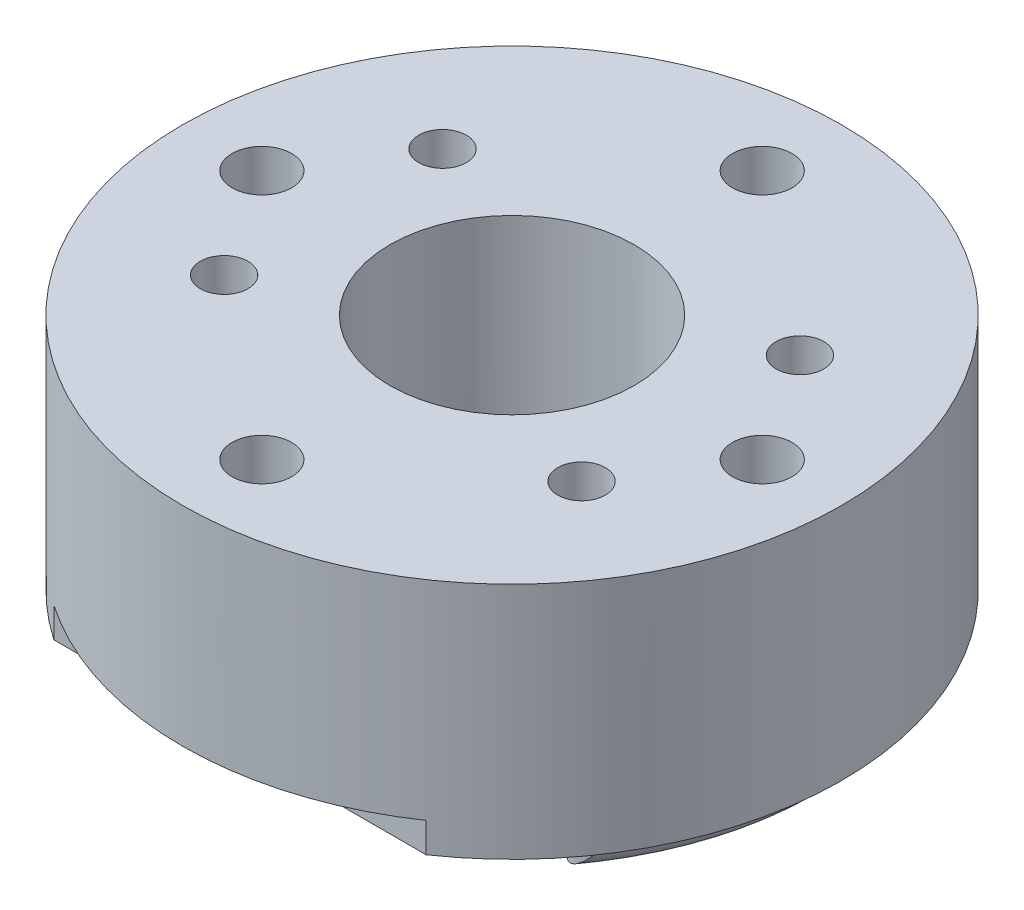
ISO-10303-21;
HEADER;
FILE_DESCRIPTION(('STEP AP214'),'2;1');
FILE_NAME('part.step','',(''),(''),'','','');
FILE_SCHEMA(('AUTOMOTIVE_DESIGN { 1 0 10303 214 1 1 1 1 }'));
ENDSEC;
DATA;
#1=APPLICATION_CONTEXT('core data for automotive mechanical design processes');
#2=APPLICATION_PROTOCOL_DEFINITION('international standard','automotive_design',2000,#1);
#3=PRODUCT_CONTEXT('',#1,'mechanical');
#4=PRODUCT('Part','Part','',(#3));
#5=PRODUCT_RELATED_PRODUCT_CATEGORY('part','',(#4));
#6=PRODUCT_DEFINITION_FORMATION('','',#4);
#7=PRODUCT_DEFINITION_CONTEXT('part definition',#1,'design');
#8=PRODUCT_DEFINITION('design','',#6,#7);
#9=PRODUCT_DEFINITION_SHAPE('','',#8);
#10=(LENGTH_UNIT() NAMED_UNIT(*) SI_UNIT(.MILLI.,.METRE.));
#11=(NAMED_UNIT(*) PLANE_ANGLE_UNIT() SI_UNIT($,.RADIAN.));
#12=(NAMED_UNIT(*) SI_UNIT($,.STERADIAN.) SOLID_ANGLE_UNIT());
#13=UNCERTAINTY_MEASURE_WITH_UNIT(LENGTH_MEASURE(1.E-05),#10,'distance_accuracy_value','');
#14=(GEOMETRIC_REPRESENTATION_CONTEXT(3) GLOBAL_UNCERTAINTY_ASSIGNED_CONTEXT((#13)) GLOBAL_UNIT_ASSIGNED_CONTEXT((#10,
#11,#12)) REPRESENTATION_CONTEXT('',''));
#15=CARTESIAN_POINT('',(0.,0.,0.));
#16=DIRECTION('',(0.,0.,1.));
#17=DIRECTION('',(1.,0.,0.));
#18=AXIS2_PLACEMENT_3D('',#15,#16,#17);
#19=CARTESIAN_POINT('',(-11.2,-13.5,-7.69999999999999));
#20=DIRECTION('',(-1.,0.,0.));
#21=DIRECTION('',(0.,-1.,0.));
#22=AXIS2_PLACEMENT_3D('',#19,#20,#21);
#23=PLANE('',#22);
#24=DIRECTION('',(0.,0.,1.));
#25=VECTOR('',#24,1.);
#26=CARTESIAN_POINT('',(-11.2,-12.,-7.69999999999999));
#27=LINE('',#26,#25);
#28=CARTESIAN_POINT('',(-11.2,-12.,0.538516480713569));
#29=VERTEX_POINT('',#28);
#30=CARTESIAN_POINT('',(-11.2,-12.,8.01997506230538));
#31=VERTEX_POINT('',#30);
#32=EDGE_CURVE('E326',#29,#31,#27,.T.);
#33=ORIENTED_EDGE('',*,*,#32,.T.);
#34=DIRECTION('',(0.,1.,0.));
#35=VECTOR('',#34,1.);
#36=CARTESIAN_POINT('',(-11.2,-13.5,8.01997506230538));
#37=LINE('',#36,#35);
#38=CARTESIAN_POINT('',(-11.2,-13.5,8.01997506230538));
#39=VERTEX_POINT('',#38);
#40=EDGE_CURVE('E362',#31,#39,#37,.F.);
#41=ORIENTED_EDGE('',*,*,#40,.T.);
#42=DIRECTION('',(0.,0.,1.));
#43=VECTOR('',#42,1.);
#44=CARTESIAN_POINT('',(-11.2,-13.5,-7.69999999999999));
#45=LINE('',#44,#43);
#46=CARTESIAN_POINT('',(-11.2,-13.5,0.538516480713569));
#47=VERTEX_POINT('',#46);
#48=EDGE_CURVE('E315',#47,#39,#45,.T.);
#49=ORIENTED_EDGE('',*,*,#48,.F.);
#50=DIRECTION('',(0.,1.,0.));
#51=VECTOR('',#50,1.);
#52=CARTESIAN_POINT('',(-11.2,-13.5,0.538516480713569));
#53=LINE('',#52,#51);
#54=EDGE_CURVE('E271',#47,#29,#53,.T.);
#55=ORIENTED_EDGE('',*,*,#54,.T.);
#56=EDGE_LOOP('',(#33,#41,#49,#55));
#57=FACE_BOUND('',#56,.T.);
#58=ADVANCED_FACE('F33',(#57),#23,.F.);
#59=CARTESIAN_POINT('',(11.2,-13.5,10.8590975683986));
#60=DIRECTION('',(1.,0.,0.));
#61=DIRECTION('',(0.,1.,0.));
#62=AXIS2_PLACEMENT_3D('',#59,#60,#61);
#63=PLANE('',#62);
#64=DIRECTION('',(0.,0.,-1.));
#65=VECTOR('',#64,1.);
#66=CARTESIAN_POINT('',(11.2,-13.5,10.8590975683986));
#67=LINE('',#66,#65);
#68=CARTESIAN_POINT('',(11.2,-13.5,-0.538516480713569));
#69=VERTEX_POINT('',#68);
#70=CARTESIAN_POINT('',(11.2,-13.5,-7.69999999999999));
#71=VERTEX_POINT('',#70);
#72=EDGE_CURVE('E320',#69,#71,#67,.T.);
#73=ORIENTED_EDGE('',*,*,#72,.F.);
#74=DIRECTION('',(0.,1.,0.));
#75=VECTOR('',#74,1.);
#76=CARTESIAN_POINT('',(11.2,-13.5,-0.538516480713569));
#77=LINE('',#76,#75);
#78=CARTESIAN_POINT('',(11.2,-12.,-0.538516480713569));
#79=VERTEX_POINT('',#78);
#80=EDGE_CURVE('E280',#69,#79,#77,.T.);
#81=ORIENTED_EDGE('',*,*,#80,.T.);
#82=DIRECTION('',(0.,0.,-1.));
#83=VECTOR('',#82,1.);
#84=CARTESIAN_POINT('',(11.2,-12.,10.8590975683986));
#85=LINE('',#84,#83);
#86=CARTESIAN_POINT('',(11.2,-12.,-7.69999999999999));
#87=VERTEX_POINT('',#86);
#88=EDGE_CURVE('E333',#79,#87,#85,.T.);
#89=ORIENTED_EDGE('',*,*,#88,.T.);
#90=DIRECTION('',(0.,1.,0.));
#91=VECTOR('',#90,1.);
#92=CARTESIAN_POINT('',(11.2,-13.5,-7.69999999999999));
#93=LINE('',#92,#91);
#94=EDGE_CURVE('E323',#71,#87,#93,.T.);
#95=ORIENTED_EDGE('',*,*,#94,.F.);
#96=EDGE_LOOP('',(#73,#81,#89,#95));
#97=FACE_BOUND('',#96,.T.);
#98=ADVANCED_FACE('F473',(#97),#63,.F.);
#99=CARTESIAN_POINT('',(0.,-12.,0.));
#100=DIRECTION('',(0.,1.,0.));
#101=DIRECTION('',(-1.,0.,0.));
#102=AXIS2_PLACEMENT_3D('',#99,#100,#101);
#103=PLANE('',#102);
#104=CARTESIAN_POINT('',(-9.,-12.,-5.5));
#105=DIRECTION('',(0.,-1.,0.));
#106=DIRECTION('',(1.,0.,0.));
#107=AXIS2_PLACEMENT_3D('',#104,#105,#106);
#108=CIRCLE('',#107,1.2);
#109=CARTESIAN_POINT('',(-7.8,-12.,-5.5));
#110=VERTEX_POINT('',#109);
#111=EDGE_CURVE('E303',#110,#110,#108,.T.);
#112=ORIENTED_EDGE('',*,*,#111,.F.);
#113=EDGE_LOOP('',(#112));
#114=FACE_BOUND('',#113,.T.);
#115=CARTESIAN_POINT('',(-9.,-12.,5.5));
#116=DIRECTION('',(0.,-1.,0.));
#117=DIRECTION('',(1.,0.,0.));
#118=AXIS2_PLACEMENT_3D('',#115,#116,#117);
#119=CIRCLE('',#118,1.2);
#120=CARTESIAN_POINT('',(-7.8,-12.,5.5));
#121=VERTEX_POINT('',#120);
#122=EDGE_CURVE('E297',#121,#121,#119,.T.);
#123=ORIENTED_EDGE('',*,*,#122,.F.);
#124=EDGE_LOOP('',(#123));
#125=FACE_BOUND('',#124,.T.);
#126=CARTESIAN_POINT('',(9.,-12.,5.50000000000001));
#127=DIRECTION('',(0.,-1.,0.));
#128=DIRECTION('',(1.,0.,0.));
#129=AXIS2_PLACEMENT_3D('',#126,#127,#128);
#130=CIRCLE('',#129,1.2);
#131=CARTESIAN_POINT('',(10.2,-12.,5.50000000000001));
#132=VERTEX_POINT('',#131);
#133=EDGE_CURVE('E291',#132,#132,#130,.T.);
#134=ORIENTED_EDGE('',*,*,#133,.F.);
#135=EDGE_LOOP('',(#134));
#136=FACE_BOUND('',#135,.T.);
#137=CARTESIAN_POINT('',(9.,-12.,-5.49999999999999));
#138=DIRECTION('',(0.,-1.,0.));
#139=DIRECTION('',(1.,0.,0.));
#140=AXIS2_PLACEMENT_3D('',#137,#138,#139);
#141=CIRCLE('',#140,1.2);
#142=CARTESIAN_POINT('',(10.2,-12.,-5.49999999999999));
#143=VERTEX_POINT('',#142);
#144=EDGE_CURVE('E290',#143,#143,#141,.T.);
#145=ORIENTED_EDGE('',*,*,#144,.F.);
#146=EDGE_LOOP('',(#145));
#147=FACE_BOUND('',#146,.T.);
#148=CARTESIAN_POINT('',(0.,-12.,12.6));
#149=DIRECTION('',(0.,1.,0.));
#150=DIRECTION('',(-1.,0.,0.));
#151=AXIS2_PLACEMENT_3D('',#148,#149,#150);
#152=CIRCLE('',#151,1.5);
#153=CARTESIAN_POINT('',(1.01980390271851,-12.,13.7));
#154=VERTEX_POINT('',#153);
#155=CARTESIAN_POINT('',(1.01980390271861,-12.,11.5));
#156=VERTEX_POINT('',#155);
#157=EDGE_CURVE('E286',#154,#156,#152,.T.);
#158=ORIENTED_EDGE('',*,*,#157,.T.);
#159=DIRECTION('',(-1.,0.,0.));
#160=VECTOR('',#159,1.);
#161=CARTESIAN_POINT('',(3.35,-12.,11.5));
#162=LINE('',#161,#160);
#163=CARTESIAN_POINT('',(3.35,-12.,11.5));
#164=VERTEX_POINT('',#163);
#165=EDGE_CURVE('E213',#164,#156,#162,.T.);
#166=ORIENTED_EDGE('',*,*,#165,.F.);
#167=DIRECTION('',(0.,0.,1.));
#168=VECTOR('',#167,1.);
#169=CARTESIAN_POINT('',(3.35,-12.,4.5));
#170=LINE('',#169,#168);
#171=CARTESIAN_POINT('',(3.35,-12.,5.15751878329105));
#172=VERTEX_POINT('',#171);
#173=EDGE_CURVE('E227',#172,#164,#170,.T.);
#174=ORIENTED_EDGE('',*,*,#173,.F.);
#175=CARTESIAN_POINT('',(0.,-12.,0.));
#176=DIRECTION('',(0.,1.,0.));
#177=DIRECTION('',(-1.,0.,0.));
#178=AXIS2_PLACEMENT_3D('',#175,#176,#177);
#179=CIRCLE('',#178,6.15000000000001);
#180=CARTESIAN_POINT('',(-3.65,-12.,4.94974746830584));
#181=VERTEX_POINT('',#180);
#182=EDGE_CURVE('E345',#181,#172,#179,.F.);
#183=ORIENTED_EDGE('',*,*,#182,.F.);
#184=DIRECTION('',(0.,0.,-1.));
#185=VECTOR('',#184,1.);
#186=CARTESIAN_POINT('',(-3.65,-12.,9.));
#187=LINE('',#186,#185);
#188=CARTESIAN_POINT('',(-3.65,-12.,9.));
#189=VERTEX_POINT('',#188);
#190=EDGE_CURVE('E225',#189,#181,#187,.T.);
#191=ORIENTED_EDGE('',*,*,#190,.F.);
#192=DIRECTION('',(1.,0.,0.));
#193=VECTOR('',#192,1.);
#194=CARTESIAN_POINT('',(-5.2,-12.,9.));
#195=LINE('',#194,#193);
#196=CARTESIAN_POINT('',(-5.2,-12.,9.));
#197=VERTEX_POINT('',#196);
#198=EDGE_CURVE('E223',#197,#189,#195,.T.);
#199=ORIENTED_EDGE('',*,*,#198,.F.);
#200=DIRECTION('',(0.,0.,-1.));
#201=VECTOR('',#200,1.);
#202=CARTESIAN_POINT('',(-5.2,-12.,11.5));
#203=LINE('',#202,#201);
#204=CARTESIAN_POINT('',(-5.2,-12.,11.5));
#205=VERTEX_POINT('',#204);
#206=EDGE_CURVE('E196',#205,#197,#203,.T.);
#207=ORIENTED_EDGE('',*,*,#206,.F.);
#208=CARTESIAN_POINT('',(-1.01980390271861,-12.,11.5));
#209=VERTEX_POINT('',#208);
#210=EDGE_CURVE('E215',#209,#205,#162,.T.);
#211=ORIENTED_EDGE('',*,*,#210,.F.);
#212=CARTESIAN_POINT('',(-1.01980390271851,-12.,13.7));
#213=VERTEX_POINT('',#212);
#214=EDGE_CURVE('E283',#209,#213,#152,.T.);
#215=ORIENTED_EDGE('',*,*,#214,.T.);
#216=DIRECTION('',(1.,0.,0.));
#217=VECTOR('',#216,1.);
#218=CARTESIAN_POINT('',(-10.,-12.,13.7));
#219=LINE('',#218,#217);
#220=CARTESIAN_POINT('',(-9.37389993545901,-12.,13.7));
#221=VERTEX_POINT('',#220);
#222=EDGE_CURVE('E239',#221,#213,#219,.T.);
#223=ORIENTED_EDGE('',*,*,#222,.F.);
#224=CARTESIAN_POINT('',(0.,-12.,0.));
#225=DIRECTION('',(0.,1.,0.));
#226=DIRECTION('',(-1.,0.,0.));
#227=AXIS2_PLACEMENT_3D('',#224,#225,#226);
#228=CIRCLE('',#227,16.6);
#229=CARTESIAN_POINT('',(9.37389993545901,-12.,13.7));
#230=VERTEX_POINT('',#229);
#231=EDGE_CURVE('E341',#221,#230,#228,.F.);
#232=ORIENTED_EDGE('',*,*,#231,.T.);
#233=EDGE_CURVE('E240',#154,#230,#219,.T.);
#234=ORIENTED_EDGE('',*,*,#233,.F.);
#235=EDGE_LOOP('',(#158,#166,#174,#183,#191,#199,#207,#211,#215,#223,#232,#234));
#236=FACE_BOUND('',#235,.T.);
#237=ORIENTED_EDGE('',*,*,#88,.F.);
#238=CARTESIAN_POINT('',(12.6,-12.,0.));
#239=DIRECTION('',(0.,1.,0.));
#240=DIRECTION('',(-1.,0.,0.));
#241=AXIS2_PLACEMENT_3D('',#238,#239,#240);
#242=CIRCLE('',#241,1.5);
#243=CARTESIAN_POINT('',(11.2,-12.,0.538516480713569));
#244=VERTEX_POINT('',#243);
#245=EDGE_CURVE('E277',#79,#244,#242,.T.);
#246=ORIENTED_EDGE('',*,*,#245,.T.);
#247=CARTESIAN_POINT('',(11.2,-12.,8.01997506230538));
#248=VERTEX_POINT('',#247);
#249=EDGE_CURVE('E316',#248,#244,#85,.T.);
#250=ORIENTED_EDGE('',*,*,#249,.F.);
#251=CARTESIAN_POINT('',(12.2,-12.,8.01997506230538));
#252=DIRECTION('',(0.,1.,0.));
#253=DIRECTION('',(-1.,0.,0.));
#254=AXIS2_PLACEMENT_3D('',#251,#252,#253);
#255=CIRCLE('',#254,1.);
#256=CARTESIAN_POINT('',(13.0356164383562,-12.,8.56928842273726));
#257=VERTEX_POINT('',#256);
#258=EDGE_CURVE('E374',#248,#257,#255,.T.);
#259=ORIENTED_EDGE('',*,*,#258,.T.);
#260=CARTESIAN_POINT('',(0.,-12.,0.));
#261=DIRECTION('',(0.,-1.,0.));
#262=DIRECTION('',(1.,0.,0.));
#263=AXIS2_PLACEMENT_3D('',#260,#261,#262);
#264=CIRCLE('',#263,15.6);
#265=CARTESIAN_POINT('',(-13.0356164383562,-12.,8.56928842273726));
#266=VERTEX_POINT('',#265);
#267=EDGE_CURVE('E330',#266,#257,#264,.T.);
#268=ORIENTED_EDGE('',*,*,#267,.F.);
#269=CARTESIAN_POINT('',(-12.2,-12.,8.01997506230538));
#270=DIRECTION('',(0.,1.,0.));
#271=DIRECTION('',(-1.,0.,0.));
#272=AXIS2_PLACEMENT_3D('',#269,#270,#271);
#273=CIRCLE('',#272,1.);
#274=EDGE_CURVE('E372',#266,#31,#273,.T.);
#275=ORIENTED_EDGE('',*,*,#274,.T.);
#276=ORIENTED_EDGE('',*,*,#32,.F.);
#277=CARTESIAN_POINT('',(-12.6,-12.,0.));
#278=DIRECTION('',(0.,1.,0.));
#279=DIRECTION('',(-1.,0.,0.));
#280=AXIS2_PLACEMENT_3D('',#277,#278,#279);
#281=CIRCLE('',#280,1.5);
#282=CARTESIAN_POINT('',(-11.2,-12.,-0.538516480713569));
#283=VERTEX_POINT('',#282);
#284=EDGE_CURVE('E268',#29,#283,#281,.T.);
#285=ORIENTED_EDGE('',*,*,#284,.T.);
#286=CARTESIAN_POINT('',(-11.2,-12.,-7.69999999999999));
#287=VERTEX_POINT('',#286);
#288=EDGE_CURVE('E327',#287,#283,#27,.T.);
#289=ORIENTED_EDGE('',*,*,#288,.F.);
#290=DIRECTION('',(-1.,0.,0.));
#291=VECTOR('',#290,1.);
#292=CARTESIAN_POINT('',(11.2,-12.,-7.69999999999999));
#293=LINE('',#292,#291);
#294=EDGE_CURVE('E309',#87,#287,#293,.T.);
#295=ORIENTED_EDGE('',*,*,#294,.F.);
#296=EDGE_LOOP('',(#237,#246,#250,#259,#268,#275,#276,#285,#289,#295));
#297=FACE_BOUND('',#296,.T.);
#298=ADVANCED_FACE('F432',(#114,#125,#136,#147,#236,#297),#103,.F.);
#299=CARTESIAN_POINT('',(0.,-58.9518902707866,0.));
#300=DIRECTION('',(0.,1.,0.));
#301=DIRECTION('',(0.,0.,1.));
#302=AXIS2_PLACEMENT_3D('',#299,#300,#301);
#303=CYLINDRICAL_SURFACE('',#302,16.6);
#304=DIRECTION('',(0.,1.,0.));
#305=VECTOR('',#304,1.);
#306=CARTESIAN_POINT('',(-9.37389993545901,-58.9518902707866,13.7));
#307=LINE('',#306,#305);
#308=CARTESIAN_POINT('',(-9.37389993545901,-10.5,13.7));
#309=VERTEX_POINT('',#308);
#310=EDGE_CURVE('E246',#309,#221,#307,.F.);
#311=ORIENTED_EDGE('',*,*,#310,.F.);
#312=CARTESIAN_POINT('',(0.,-10.5,0.));
#313=DIRECTION('',(0.,-1.,0.));
#314=DIRECTION('',(0.,0.,-1.));
#315=AXIS2_PLACEMENT_3D('',#312,#313,#314);
#316=CIRCLE('',#315,16.6);
#317=CARTESIAN_POINT('',(9.37389993545901,-10.5,13.7));
#318=VERTEX_POINT('',#317);
#319=EDGE_CURVE('E231',#309,#318,#316,.F.);
#320=ORIENTED_EDGE('',*,*,#319,.T.);
#321=DIRECTION('',(0.,1.,0.));
#322=VECTOR('',#321,1.);
#323=CARTESIAN_POINT('',(9.37389993545901,-58.9518902707866,13.7));
#324=LINE('',#323,#322);
#325=EDGE_CURVE('E244',#230,#318,#324,.T.);
#326=ORIENTED_EDGE('',*,*,#325,.F.);
#327=ORIENTED_EDGE('',*,*,#231,.F.);
#328=EDGE_LOOP('',(#311,#320,#326,#327));
#329=FACE_BOUND('',#328,.T.);
#330=CARTESIAN_POINT('',(0.,0.,0.));
#331=DIRECTION('',(0.,1.,0.));
#332=DIRECTION('',(0.,0.,1.));
#333=AXIS2_PLACEMENT_3D('',#330,#331,#332);
#334=CIRCLE('',#333,16.6);
#335=CARTESIAN_POINT('',(0.,0.,16.6));
#336=VERTEX_POINT('',#335);
#337=EDGE_CURVE('E348',#336,#336,#334,.T.);
#338=ORIENTED_EDGE('',*,*,#337,.F.);
#339=EDGE_LOOP('',(#338));
#340=FACE_BOUND('',#339,.T.);
#341=ADVANCED_FACE('F398',(#329,#340),#303,.T.);
#342=CARTESIAN_POINT('',(0.,0.,0.));
#343=DIRECTION('',(0.,1.,0.));
#344=DIRECTION('',(0.,0.,1.));
#345=AXIS2_PLACEMENT_3D('',#342,#343,#344);
#346=PLANE('',#345);
#347=CARTESIAN_POINT('',(0.,0.,-12.6));
#348=DIRECTION('',(0.,1.,0.));
#349=DIRECTION('',(0.,0.,1.));
#350=AXIS2_PLACEMENT_3D('',#347,#348,#349);
#351=CIRCLE('',#350,1.5);
#352=CARTESIAN_POINT('',(0.,0.,-11.1));
#353=VERTEX_POINT('',#352);
#354=EDGE_CURVE('E255',#353,#353,#351,.T.);
#355=ORIENTED_EDGE('',*,*,#354,.F.);
#356=EDGE_LOOP('',(#355));
#357=FACE_BOUND('',#356,.T.);
#358=CARTESIAN_POINT('',(12.6,0.,0.));
#359=DIRECTION('',(0.,1.,0.));
#360=DIRECTION('',(0.,0.,1.));
#361=AXIS2_PLACEMENT_3D('',#358,#359,#360);
#362=CIRCLE('',#361,1.5);
#363=CARTESIAN_POINT('',(12.6,0.,1.5));
#364=VERTEX_POINT('',#363);
#365=EDGE_CURVE('E258',#364,#364,#362,.T.);
#366=ORIENTED_EDGE('',*,*,#365,.F.);
#367=EDGE_LOOP('',(#366));
#368=FACE_BOUND('',#367,.T.);
#369=CARTESIAN_POINT('',(-12.6,0.,0.));
#370=DIRECTION('',(0.,1.,0.));
#371=DIRECTION('',(0.,0.,1.));
#372=AXIS2_PLACEMENT_3D('',#369,#370,#371);
#373=CIRCLE('',#372,1.5);
#374=CARTESIAN_POINT('',(-12.6,0.,1.5));
#375=VERTEX_POINT('',#374);
#376=EDGE_CURVE('E261',#375,#375,#373,.T.);
#377=ORIENTED_EDGE('',*,*,#376,.F.);
#378=EDGE_LOOP('',(#377));
#379=FACE_BOUND('',#378,.T.);
#380=CARTESIAN_POINT('',(0.,0.,12.6));
#381=DIRECTION('',(0.,1.,0.));
#382=DIRECTION('',(0.,0.,1.));
#383=AXIS2_PLACEMENT_3D('',#380,#381,#382);
#384=CIRCLE('',#383,1.5);
#385=CARTESIAN_POINT('',(0.,0.,14.1));
#386=VERTEX_POINT('',#385);
#387=EDGE_CURVE('E250',#386,#386,#384,.T.);
#388=ORIENTED_EDGE('',*,*,#387,.F.);
#389=EDGE_LOOP('',(#388));
#390=FACE_BOUND('',#389,.T.);
#391=CARTESIAN_POINT('',(-9.,0.,-5.5));
#392=DIRECTION('',(0.,-1.,0.));
#393=DIRECTION('',(1.,0.,0.));
#394=AXIS2_PLACEMENT_3D('',#391,#392,#393);
#395=CIRCLE('',#394,1.2);
#396=CARTESIAN_POINT('',(-7.8,0.,-5.5));
#397=VERTEX_POINT('',#396);
#398=EDGE_CURVE('E300',#397,#397,#395,.T.);
#399=ORIENTED_EDGE('',*,*,#398,.T.);
#400=EDGE_LOOP('',(#399));
#401=FACE_BOUND('',#400,.T.);
#402=CARTESIAN_POINT('',(-9.,0.,5.5));
#403=DIRECTION('',(0.,-1.,0.));
#404=DIRECTION('',(1.,0.,0.));
#405=AXIS2_PLACEMENT_3D('',#402,#403,#404);
#406=CIRCLE('',#405,1.2);
#407=CARTESIAN_POINT('',(-7.8,0.,5.5));
#408=VERTEX_POINT('',#407);
#409=EDGE_CURVE('E294',#408,#408,#406,.T.);
#410=ORIENTED_EDGE('',*,*,#409,.T.);
#411=EDGE_LOOP('',(#410));
#412=FACE_BOUND('',#411,.T.);
#413=CARTESIAN_POINT('',(9.,0.,5.50000000000001));
#414=DIRECTION('',(0.,-1.,0.));
#415=DIRECTION('',(1.,0.,0.));
#416=AXIS2_PLACEMENT_3D('',#413,#414,#415);
#417=CIRCLE('',#416,1.2);
#418=CARTESIAN_POINT('',(10.2,0.,5.50000000000001));
#419=VERTEX_POINT('',#418);
#420=EDGE_CURVE('E287',#419,#419,#417,.T.);
#421=ORIENTED_EDGE('',*,*,#420,.T.);
#422=EDGE_LOOP('',(#421));
#423=FACE_BOUND('',#422,.T.);
#424=CARTESIAN_POINT('',(9.,0.,-5.49999999999999));
#425=DIRECTION('',(0.,-1.,0.));
#426=DIRECTION('',(1.,0.,0.));
#427=AXIS2_PLACEMENT_3D('',#424,#425,#426);
#428=CIRCLE('',#427,1.2);
#429=CARTESIAN_POINT('',(10.2,0.,-5.49999999999999));
#430=VERTEX_POINT('',#429);
#431=EDGE_CURVE('E306',#430,#430,#428,.T.);
#432=ORIENTED_EDGE('',*,*,#431,.T.);
#433=EDGE_LOOP('',(#432));
#434=FACE_BOUND('',#433,.T.);
#435=CARTESIAN_POINT('',(0.,0.,0.));
#436=DIRECTION('',(0.,1.,0.));
#437=DIRECTION('',(0.,0.,1.));
#438=AXIS2_PLACEMENT_3D('',#435,#436,#437);
#439=CIRCLE('',#438,6.15000000000001);
#440=CARTESIAN_POINT('',(0.,0.,6.15));
#441=VERTEX_POINT('',#440);
#442=EDGE_CURVE('E340',#441,#441,#439,.T.);
#443=ORIENTED_EDGE('',*,*,#442,.F.);
#444=EDGE_LOOP('',(#443));
#445=FACE_BOUND('',#444,.T.);
#446=ORIENTED_EDGE('',*,*,#337,.T.);
#447=EDGE_LOOP('',(#446));
#448=FACE_BOUND('',#447,.T.);
#449=ADVANCED_FACE('F659',(#357,#368,#379,#390,#401,#412,#423,#434,#445,#448),#346,.T.);
#450=CARTESIAN_POINT('',(0.,-58.9518902707866,0.));
#451=DIRECTION('',(0.,1.,0.));
#452=DIRECTION('',(0.,0.,1.));
#453=AXIS2_PLACEMENT_3D('',#450,#451,#452);
#454=CYLINDRICAL_SURFACE('',#453,6.15000000000001);
#455=ORIENTED_EDGE('',*,*,#182,.T.);
#456=DIRECTION('',(0.,1.,0.));
#457=VECTOR('',#456,1.);
#458=CARTESIAN_POINT('',(3.35,-58.9518902707866,5.15751878329106));
#459=LINE('',#458,#457);
#460=CARTESIAN_POINT('',(3.35,-10.5,5.15751878329105));
#461=VERTEX_POINT('',#460);
#462=EDGE_CURVE('E11',#172,#461,#459,.T.);
#463=ORIENTED_EDGE('',*,*,#462,.T.);
#464=CARTESIAN_POINT('',(0.,-10.5,0.));
#465=DIRECTION('',(0.,-1.,0.));
#466=DIRECTION('',(0.,0.,-1.));
#467=AXIS2_PLACEMENT_3D('',#464,#465,#466);
#468=CIRCLE('',#467,6.15000000000001);
#469=CARTESIAN_POINT('',(-3.65,-10.5,4.94974746830584));
#470=VERTEX_POINT('',#469);
#471=EDGE_CURVE('E248',#470,#461,#468,.F.);
#472=ORIENTED_EDGE('',*,*,#471,.F.);
#473=DIRECTION('',(0.,1.,0.));
#474=VECTOR('',#473,1.);
#475=CARTESIAN_POINT('',(-3.65,-58.9518902707866,4.94974746830584));
#476=LINE('',#475,#474);
#477=EDGE_CURVE('E42',#470,#181,#476,.F.);
#478=ORIENTED_EDGE('',*,*,#477,.T.);
#479=EDGE_LOOP('',(#455,#463,#472,#478));
#480=FACE_BOUND('',#479,.T.);
#481=ORIENTED_EDGE('',*,*,#442,.T.);
#482=EDGE_LOOP('',(#481));
#483=FACE_BOUND('',#482,.T.);
#484=ADVANCED_FACE('F425',(#480,#483),#454,.F.);
#485=CARTESIAN_POINT('',(11.2,-13.5,-7.69999999999999));
#486=DIRECTION('',(0.,0.,-1.));
#487=DIRECTION('',(-1.,0.,0.));
#488=AXIS2_PLACEMENT_3D('',#485,#486,#487);
#489=PLANE('',#488);
#490=ORIENTED_EDGE('',*,*,#294,.T.);
#491=DIRECTION('',(0.,1.,0.));
#492=VECTOR('',#491,1.);
#493=CARTESIAN_POINT('',(-11.2,-13.5,-7.69999999999999));
#494=LINE('',#493,#492);
#495=CARTESIAN_POINT('',(-11.2,-13.5,-7.69999999999999));
#496=VERTEX_POINT('',#495);
#497=EDGE_CURVE('E337',#496,#287,#494,.T.);
#498=ORIENTED_EDGE('',*,*,#497,.F.);
#499=DIRECTION('',(-1.,0.,0.));
#500=VECTOR('',#499,1.);
#501=CARTESIAN_POINT('',(11.2,-13.5,-7.69999999999999));
#502=LINE('',#501,#500);
#503=EDGE_CURVE('E312',#71,#496,#502,.T.);
#504=ORIENTED_EDGE('',*,*,#503,.F.);
#505=ORIENTED_EDGE('',*,*,#94,.T.);
#506=EDGE_LOOP('',(#490,#498,#504,#505));
#507=FACE_BOUND('',#506,.T.);
#508=ADVANCED_FACE('F488',(#507),#489,.F.);
#509=ORIENTED_EDGE('',*,*,#288,.T.);
#510=DIRECTION('',(0.,1.,0.));
#511=VECTOR('',#510,1.);
#512=CARTESIAN_POINT('',(-11.2,-13.5,-0.538516480713569));
#513=LINE('',#512,#511);
#514=CARTESIAN_POINT('',(-11.2,-13.5,-0.538516480713569));
#515=VERTEX_POINT('',#514);
#516=EDGE_CURVE('E254',#283,#515,#513,.F.);
#517=ORIENTED_EDGE('',*,*,#516,.T.);
#518=EDGE_CURVE('E317',#496,#515,#45,.T.);
#519=ORIENTED_EDGE('',*,*,#518,.F.);
#520=ORIENTED_EDGE('',*,*,#497,.T.);
#521=EDGE_LOOP('',(#509,#517,#519,#520));
#522=FACE_BOUND('',#521,.T.);
#523=ADVANCED_FACE('F476',(#522),#23,.F.);
#524=CARTESIAN_POINT('',(0.,-13.5,0.));
#525=DIRECTION('',(0.,1.,0.));
#526=DIRECTION('',(-1.,0.,0.));
#527=AXIS2_PLACEMENT_3D('',#524,#525,#526);
#528=CYLINDRICAL_SURFACE('',#527,15.6);
#529=DIRECTION('',(0.,1.,0.));
#530=VECTOR('',#529,1.);
#531=CARTESIAN_POINT('',(13.0356164383562,-13.5,8.56928842273726));
#532=LINE('',#531,#530);
#533=CARTESIAN_POINT('',(13.0356164383562,-12.5,8.56928842273726));
#534=VERTEX_POINT('',#533);
#535=EDGE_CURVE('E357',#257,#534,#532,.F.);
#536=ORIENTED_EDGE('',*,*,#535,.T.);
#537=CARTESIAN_POINT('',(0.,-12.5,0.));
#538=DIRECTION('',(0.,-1.,0.));
#539=DIRECTION('',(1.,0.,0.));
#540=AXIS2_PLACEMENT_3D('',#537,#538,#539);
#541=CIRCLE('',#540,15.6);
#542=CARTESIAN_POINT('',(-13.0356164383562,-12.5,8.56928842273726));
#543=VERTEX_POINT('',#542);
#544=EDGE_CURVE('E385',#534,#543,#541,.F.);
#545=ORIENTED_EDGE('',*,*,#544,.T.);
#546=DIRECTION('',(0.,1.,0.));
#547=VECTOR('',#546,1.);
#548=CARTESIAN_POINT('',(-13.0356164383562,-13.5,8.56928842273726));
#549=LINE('',#548,#547);
#550=EDGE_CURVE('E360',#543,#266,#549,.T.);
#551=ORIENTED_EDGE('',*,*,#550,.T.);
#552=ORIENTED_EDGE('',*,*,#267,.T.);
#553=EDGE_LOOP('',(#536,#545,#551,#552));
#554=FACE_BOUND('',#553,.T.);
#555=ADVANCED_FACE('F487',(#554),#528,.T.);
#556=CARTESIAN_POINT('',(11.2,-13.5,8.01997506230538));
#557=VERTEX_POINT('',#556);
#558=CARTESIAN_POINT('',(11.2,-13.5,0.538516480713569));
#559=VERTEX_POINT('',#558);
#560=EDGE_CURVE('E321',#557,#559,#67,.T.);
#561=ORIENTED_EDGE('',*,*,#560,.F.);
#562=DIRECTION('',(0.,1.,0.));
#563=VECTOR('',#562,1.);
#564=CARTESIAN_POINT('',(11.2,-13.5,8.01997506230538));
#565=LINE('',#564,#563);
#566=EDGE_CURVE('E369',#557,#248,#565,.T.);
#567=ORIENTED_EDGE('',*,*,#566,.T.);
#568=ORIENTED_EDGE('',*,*,#249,.T.);
#569=DIRECTION('',(0.,1.,0.));
#570=VECTOR('',#569,1.);
#571=CARTESIAN_POINT('',(11.2,-13.5,0.538516480713569));
#572=LINE('',#571,#570);
#573=EDGE_CURVE('E274',#244,#559,#572,.F.);
#574=ORIENTED_EDGE('',*,*,#573,.T.);
#575=EDGE_LOOP('',(#561,#567,#568,#574));
#576=FACE_BOUND('',#575,.T.);
#577=ADVANCED_FACE('F482',(#576),#63,.F.);
#578=CARTESIAN_POINT('',(0.,-13.5,0.));
#579=DIRECTION('',(0.,-1.,0.));
#580=DIRECTION('',(1.,0.,0.));
#581=AXIS2_PLACEMENT_3D('',#578,#579,#580);
#582=PLANE('',#581);
#583=CARTESIAN_POINT('',(0.,-13.5,-12.6));
#584=DIRECTION('',(0.,1.,0.));
#585=DIRECTION('',(0.,0.,1.));
#586=AXIS2_PLACEMENT_3D('',#583,#584,#585);
#587=CIRCLE('',#586,1.5);
#588=CARTESIAN_POINT('',(0.,-13.5,-11.1));
#589=VERTEX_POINT('',#588);
#590=EDGE_CURVE('E251',#589,#589,#587,.T.);
#591=ORIENTED_EDGE('',*,*,#590,.T.);
#592=EDGE_LOOP('',(#591));
#593=FACE_BOUND('',#592,.T.);
#594=CARTESIAN_POINT('',(-12.2,-13.5,8.01997506230538));
#595=DIRECTION('',(0.,-1.,0.));
#596=DIRECTION('',(1.,0.,0.));
#597=AXIS2_PLACEMENT_3D('',#594,#595,#596);
#598=CIRCLE('',#597,1.);
#599=CARTESIAN_POINT('',(-11.622391857783,-13.5,8.83628923837035));
#600=VERTEX_POINT('',#599);
#601=EDGE_CURVE('E366',#39,#600,#598,.T.);
#602=ORIENTED_EDGE('',*,*,#601,.T.);
#603=CARTESIAN_POINT('',(0.,-13.5,0.));
#604=DIRECTION('',(0.,-1.,0.));
#605=DIRECTION('',(1.,0.,0.));
#606=AXIS2_PLACEMENT_3D('',#603,#604,#605);
#607=CIRCLE('',#606,14.6);
#608=CARTESIAN_POINT('',(11.622391857783,-13.5,8.83628923837035));
#609=VERTEX_POINT('',#608);
#610=EDGE_CURVE('E376',#600,#609,#607,.T.);
#611=ORIENTED_EDGE('',*,*,#610,.T.);
#612=CARTESIAN_POINT('',(12.2,-13.5,8.01997506230538));
#613=DIRECTION('',(0.,-1.,0.));
#614=DIRECTION('',(1.,0.,0.));
#615=AXIS2_PLACEMENT_3D('',#612,#613,#614);
#616=CIRCLE('',#615,1.);
#617=EDGE_CURVE('E364',#609,#557,#616,.T.);
#618=ORIENTED_EDGE('',*,*,#617,.T.);
#619=ORIENTED_EDGE('',*,*,#560,.T.);
#620=CARTESIAN_POINT('',(12.6,-13.5,0.));
#621=DIRECTION('',(0.,-1.,0.));
#622=DIRECTION('',(1.,0.,0.));
#623=AXIS2_PLACEMENT_3D('',#620,#621,#622);
#624=CIRCLE('',#623,1.5);
#625=EDGE_CURVE('E354',#69,#559,#624,.T.);
#626=ORIENTED_EDGE('',*,*,#625,.F.);
#627=ORIENTED_EDGE('',*,*,#72,.T.);
#628=ORIENTED_EDGE('',*,*,#503,.T.);
#629=ORIENTED_EDGE('',*,*,#518,.T.);
#630=CARTESIAN_POINT('',(-12.6,-13.5,0.));
#631=DIRECTION('',(0.,-1.,0.));
#632=DIRECTION('',(1.,0.,0.));
#633=AXIS2_PLACEMENT_3D('',#630,#631,#632);
#634=CIRCLE('',#633,1.5);
#635=EDGE_CURVE('E344',#47,#515,#634,.T.);
#636=ORIENTED_EDGE('',*,*,#635,.F.);
#637=ORIENTED_EDGE('',*,*,#48,.T.);
#638=EDGE_LOOP('',(#602,#611,#618,#619,#626,#627,#628,#629,#636,#637));
#639=FACE_BOUND('',#638,.T.);
#640=ADVANCED_FACE('F508',(#593,#639),#582,.T.);
#641=CARTESIAN_POINT('',(9.,0.,-5.49999999999999));
#642=DIRECTION('',(0.,-1.,0.));
#643=DIRECTION('',(1.,0.,0.));
#644=AXIS2_PLACEMENT_3D('',#641,#642,#643);
#645=CYLINDRICAL_SURFACE('',#644,1.2);
#646=ORIENTED_EDGE('',*,*,#431,.F.);
#647=EDGE_LOOP('',(#646));
#648=FACE_BOUND('',#647,.T.);
#649=ORIENTED_EDGE('',*,*,#144,.T.);
#650=EDGE_LOOP('',(#649));
#651=FACE_BOUND('',#650,.T.);
#652=ADVANCED_FACE('F550',(#648,#651),#645,.F.);
#653=CARTESIAN_POINT('',(9.,0.,5.50000000000001));
#654=DIRECTION('',(0.,-1.,0.));
#655=DIRECTION('',(1.,0.,0.));
#656=AXIS2_PLACEMENT_3D('',#653,#654,#655);
#657=CYLINDRICAL_SURFACE('',#656,1.2);
#658=ORIENTED_EDGE('',*,*,#420,.F.);
#659=EDGE_LOOP('',(#658));
#660=FACE_BOUND('',#659,.T.);
#661=ORIENTED_EDGE('',*,*,#133,.T.);
#662=EDGE_LOOP('',(#661));
#663=FACE_BOUND('',#662,.T.);
#664=ADVANCED_FACE('F546',(#660,#663),#657,.F.);
#665=CARTESIAN_POINT('',(-9.,0.,5.5));
#666=DIRECTION('',(0.,-1.,0.));
#667=DIRECTION('',(1.,0.,0.));
#668=AXIS2_PLACEMENT_3D('',#665,#666,#667);
#669=CYLINDRICAL_SURFACE('',#668,1.2);
#670=ORIENTED_EDGE('',*,*,#409,.F.);
#671=EDGE_LOOP('',(#670));
#672=FACE_BOUND('',#671,.T.);
#673=ORIENTED_EDGE('',*,*,#122,.T.);
#674=EDGE_LOOP('',(#673));
#675=FACE_BOUND('',#674,.T.);
#676=ADVANCED_FACE('F549',(#672,#675),#669,.F.);
#677=CARTESIAN_POINT('',(-9.,0.,-5.5));
#678=DIRECTION('',(0.,-1.,0.));
#679=DIRECTION('',(1.,0.,0.));
#680=AXIS2_PLACEMENT_3D('',#677,#678,#679);
#681=CYLINDRICAL_SURFACE('',#680,1.2);
#682=ORIENTED_EDGE('',*,*,#398,.F.);
#683=EDGE_LOOP('',(#682));
#684=FACE_BOUND('',#683,.T.);
#685=ORIENTED_EDGE('',*,*,#111,.T.);
#686=EDGE_LOOP('',(#685));
#687=FACE_BOUND('',#686,.T.);
#688=ADVANCED_FACE('F539',(#684,#687),#681,.F.);
#689=CARTESIAN_POINT('',(-12.6,-13.5,0.));
#690=DIRECTION('',(0.,1.,0.));
#691=DIRECTION('',(0.,0.,1.));
#692=AXIS2_PLACEMENT_3D('',#689,#690,#691);
#693=CYLINDRICAL_SURFACE('',#692,1.5);
#694=ORIENTED_EDGE('',*,*,#376,.T.);
#695=EDGE_LOOP('',(#694));
#696=FACE_BOUND('',#695,.T.);
#697=ORIENTED_EDGE('',*,*,#635,.T.);
#698=ORIENTED_EDGE('',*,*,#516,.F.);
#699=ORIENTED_EDGE('',*,*,#284,.F.);
#700=ORIENTED_EDGE('',*,*,#54,.F.);
#701=EDGE_LOOP('',(#697,#698,#699,#700));
#702=FACE_BOUND('',#701,.T.);
#703=ADVANCED_FACE('F501',(#696,#702),#693,.F.);
#704=CARTESIAN_POINT('',(12.6,-13.5,0.));
#705=DIRECTION('',(0.,1.,0.));
#706=DIRECTION('',(0.,0.,1.));
#707=AXIS2_PLACEMENT_3D('',#704,#705,#706);
#708=CYLINDRICAL_SURFACE('',#707,1.5);
#709=ORIENTED_EDGE('',*,*,#365,.T.);
#710=EDGE_LOOP('',(#709));
#711=FACE_BOUND('',#710,.T.);
#712=ORIENTED_EDGE('',*,*,#625,.T.);
#713=ORIENTED_EDGE('',*,*,#573,.F.);
#714=ORIENTED_EDGE('',*,*,#245,.F.);
#715=ORIENTED_EDGE('',*,*,#80,.F.);
#716=EDGE_LOOP('',(#712,#713,#714,#715));
#717=FACE_BOUND('',#716,.T.);
#718=ADVANCED_FACE('F524',(#711,#717),#708,.F.);
#719=CARTESIAN_POINT('',(0.,-13.5,-12.6));
#720=DIRECTION('',(0.,1.,0.));
#721=DIRECTION('',(0.,0.,1.));
#722=AXIS2_PLACEMENT_3D('',#719,#720,#721);
#723=CYLINDRICAL_SURFACE('',#722,1.5);
#724=ORIENTED_EDGE('',*,*,#590,.F.);
#725=EDGE_LOOP('',(#724));
#726=FACE_BOUND('',#725,.T.);
#727=ORIENTED_EDGE('',*,*,#354,.T.);
#728=EDGE_LOOP('',(#727));
#729=FACE_BOUND('',#728,.T.);
#730=ADVANCED_FACE('F530',(#726,#729),#723,.F.);
#731=CARTESIAN_POINT('',(0.,-13.5,12.6));
#732=DIRECTION('',(0.,1.,0.));
#733=DIRECTION('',(0.,0.,1.));
#734=AXIS2_PLACEMENT_3D('',#731,#732,#733);
#735=CYLINDRICAL_SURFACE('',#734,1.5);
#736=ORIENTED_EDGE('',*,*,#387,.T.);
#737=EDGE_LOOP('',(#736));
#738=FACE_BOUND('',#737,.T.);
#739=CARTESIAN_POINT('',(0.,-10.5,12.6));
#740=DIRECTION('',(0.,-1.,0.));
#741=DIRECTION('',(0.,0.,-1.));
#742=AXIS2_PLACEMENT_3D('',#739,#740,#741);
#743=CIRCLE('',#742,1.5);
#744=CARTESIAN_POINT('',(1.01980390271861,-10.5,11.5));
#745=VERTEX_POINT('',#744);
#746=CARTESIAN_POINT('',(-1.01980390271861,-10.5,11.5));
#747=VERTEX_POINT('',#746);
#748=EDGE_CURVE('E414',#745,#747,#743,.F.);
#749=ORIENTED_EDGE('',*,*,#748,.F.);
#750=DIRECTION('',(0.,1.,0.));
#751=VECTOR('',#750,1.);
#752=CARTESIAN_POINT('',(1.01980390271861,-13.5,11.5));
#753=LINE('',#752,#751);
#754=EDGE_CURVE('E419',#745,#156,#753,.F.);
#755=ORIENTED_EDGE('',*,*,#754,.T.);
#756=ORIENTED_EDGE('',*,*,#157,.F.);
#757=DIRECTION('',(0.,1.,0.));
#758=VECTOR('',#757,1.);
#759=CARTESIAN_POINT('',(1.01980390271851,-13.5,13.7));
#760=LINE('',#759,#758);
#761=CARTESIAN_POINT('',(1.01980390271851,-10.5,13.7));
#762=VERTEX_POINT('',#761);
#763=EDGE_CURVE('E408',#154,#762,#760,.T.);
#764=ORIENTED_EDGE('',*,*,#763,.T.);
#765=CARTESIAN_POINT('',(0.,-10.5,12.6));
#766=DIRECTION('',(0.,-1.,0.));
#767=DIRECTION('',(0.,0.,-1.));
#768=AXIS2_PLACEMENT_3D('',#765,#766,#767);
#769=CIRCLE('',#768,1.5);
#770=CARTESIAN_POINT('',(-1.01980390271851,-10.5,13.7));
#771=VERTEX_POINT('',#770);
#772=EDGE_CURVE('E406',#771,#762,#769,.F.);
#773=ORIENTED_EDGE('',*,*,#772,.F.);
#774=DIRECTION('',(0.,1.,0.));
#775=VECTOR('',#774,1.);
#776=CARTESIAN_POINT('',(-1.01980390271851,-13.5,13.7));
#777=LINE('',#776,#775);
#778=EDGE_CURVE('E411',#771,#213,#777,.F.);
#779=ORIENTED_EDGE('',*,*,#778,.T.);
#780=ORIENTED_EDGE('',*,*,#214,.F.);
#781=DIRECTION('',(0.,1.,0.));
#782=VECTOR('',#781,1.);
#783=CARTESIAN_POINT('',(-1.01980390271861,-13.5,11.5));
#784=LINE('',#783,#782);
#785=EDGE_CURVE('E416',#209,#747,#784,.T.);
#786=ORIENTED_EDGE('',*,*,#785,.T.);
#787=EDGE_LOOP('',(#749,#755,#756,#764,#773,#779,#780,#786));
#788=FACE_BOUND('',#787,.T.);
#789=ADVANCED_FACE('F396',(#738,#788),#735,.F.);
#790=CARTESIAN_POINT('',(-12.2,-13.5,8.01997506230538));
#791=DIRECTION('',(0.,1.,0.));
#792=DIRECTION('',(-1.,0.,0.));
#793=AXIS2_PLACEMENT_3D('',#790,#791,#792);
#794=CYLINDRICAL_SURFACE('',#793,1.);
#795=ORIENTED_EDGE('',*,*,#550,.F.);
#796=CARTESIAN_POINT('',(-11.622391857783,-13.5,8.83628923837035));
#797=CARTESIAN_POINT('',(-11.6408443243807,-13.5000030317114,8.84934963510686));
#798=CARTESIAN_POINT('',(-11.6597315685274,-13.4992336747269,8.86177020338738));
#799=CARTESIAN_POINT('',(-11.6981971673835,-13.4961964200815,8.88524977405146));
#800=CARTESIAN_POINT('',(-11.7177749252218,-13.4939297879854,8.89630991697092));
#801=CARTESIAN_POINT('',(-11.7769503666338,-13.485007661669,8.92716337203315));
#802=CARTESIAN_POINT('',(-11.8173441643562,-13.476228020197,8.94487826645297));
#803=CARTESIAN_POINT('',(-11.8986687120526,-13.4537415533077,8.97447644251643));
#804=CARTESIAN_POINT('',(-11.9395974800977,-13.4400496365407,8.98637711484096));
#805=CARTESIAN_POINT('',(-12.0211663382404,-13.4085688473049,9.00474486074343));
#806=CARTESIAN_POINT('',(-12.0618055280419,-13.3907704572203,9.01119914676351));
#807=CARTESIAN_POINT('',(-12.1582560937013,-13.3440141871842,9.02070715867343));
#808=CARTESIAN_POINT('',(-12.2135326092037,-13.3134586252549,9.0213183143976));
#809=CARTESIAN_POINT('',(-12.3206842385344,-13.2477587160625,9.01412319658281));
#810=CARTESIAN_POINT('',(-12.3725531812348,-13.2126063704436,9.00630207501763));
#811=CARTESIAN_POINT('',(-12.4900877478929,-13.1259357582834,8.97948902950785));
#812=CARTESIAN_POINT('',(-12.5540631751109,-13.0730568566329,8.95750473004281));
#813=CARTESIAN_POINT('',(-12.6738829675952,-12.9636751993843,8.90302365505947));
#814=CARTESIAN_POINT('',(-12.7297167024137,-12.9071678423341,8.87051331102727));
#815=CARTESIAN_POINT('',(-12.8317055548763,-12.7933424712578,8.79765678472613));
#816=CARTESIAN_POINT('',(-12.8780441977015,-12.7360685631905,8.75749568232958));
#817=CARTESIAN_POINT('',(-12.9620982319799,-12.620691338762,8.67025479367165));
#818=CARTESIAN_POINT('',(-12.9998322335894,-12.562590106761,8.62319030769701));
#819=CARTESIAN_POINT('',(-13.0338926909415,-12.5030303420424,8.57190388673771));
#820=CARTESIAN_POINT('',(-13.0347561141766,-12.5015151469663,8.5705971435893));
#821=CARTESIAN_POINT('',(-13.0356164383562,-12.5,8.56928842273726));
#822=B_SPLINE_CURVE_WITH_KNOTS('',3,(#796,#797,#798,#799,#800,#801,#802,#803,#804,#805,#806,
#807,#808,#809,#810,#811,#812,#813,#814,#815,#816,#817,#818,#819,#820,#821),.UNSPECIFIED.,.F.,
.F.,(4,2,2,2,2,2,2,2,2,2,2,2,4),(0.,0.0677668436563834,0.135476480880579,0.269618704365927,
0.403357206031331,0.537408845178919,0.725855102913743,0.91463373014345,1.17084665951154,
1.42739118186039,1.67837608579,1.92881289817981,1.93535047019718),.UNSPECIFIED.);
#823=EDGE_CURVE('E400',#543,#600,#822,.F.);
#824=ORIENTED_EDGE('',*,*,#823,.T.);
#825=ORIENTED_EDGE('',*,*,#601,.F.);
#826=ORIENTED_EDGE('',*,*,#40,.F.);
#827=ORIENTED_EDGE('',*,*,#274,.F.);
#828=EDGE_LOOP('',(#795,#824,#825,#826,#827));
#829=FACE_BOUND('',#828,.T.);
#830=ADVANCED_FACE('F391',(#829),#794,.T.);
#831=CARTESIAN_POINT('',(12.2,-13.5,8.01997506230538));
#832=DIRECTION('',(0.,1.,0.));
#833=DIRECTION('',(-1.,0.,0.));
#834=AXIS2_PLACEMENT_3D('',#831,#832,#833);
#835=CYLINDRICAL_SURFACE('',#834,1.);
#836=ORIENTED_EDGE('',*,*,#617,.F.);
#837=CARTESIAN_POINT('',(11.622391857783,-13.5,8.83628923837035));
#838=CARTESIAN_POINT('',(11.6408443243807,-13.5000030317114,8.84934963510686));
#839=CARTESIAN_POINT('',(11.6597315685274,-13.4992336747269,8.86177020338738));
#840=CARTESIAN_POINT('',(11.6981971673835,-13.4961964200815,8.88524977405146));
#841=CARTESIAN_POINT('',(11.7177749252218,-13.4939297879854,8.89630991697092));
#842=CARTESIAN_POINT('',(11.7769503666338,-13.4850076616691,8.92716337203315));
#843=CARTESIAN_POINT('',(11.8173441643562,-13.476228020197,8.94487826645297));
#844=CARTESIAN_POINT('',(11.8986687120526,-13.4537415533077,8.97447644251643));
#845=CARTESIAN_POINT('',(11.9395974800977,-13.4400496365407,8.98637711484096));
#846=CARTESIAN_POINT('',(12.0211663382404,-13.4085688473049,9.00474486074343));
#847=CARTESIAN_POINT('',(12.0618055280419,-13.3907704572203,9.01119914676351));
#848=CARTESIAN_POINT('',(12.1582560937013,-13.3440141871842,9.02070715867343));
#849=CARTESIAN_POINT('',(12.2135326092038,-13.3134586252549,9.0213183143976));
#850=CARTESIAN_POINT('',(12.3206842385344,-13.2477587160625,9.01412319658281));
#851=CARTESIAN_POINT('',(12.3725531812348,-13.2126063704436,9.00630207501763));
#852=CARTESIAN_POINT('',(12.4900877478929,-13.1259357582834,8.97948902950786));
#853=CARTESIAN_POINT('',(12.5540631751109,-13.073056856633,8.95750473004281));
#854=CARTESIAN_POINT('',(12.6738829675952,-12.9636751993843,8.90302365505947));
#855=CARTESIAN_POINT('',(12.7297167024137,-12.9071678423341,8.87051331102728));
#856=CARTESIAN_POINT('',(12.8317055548763,-12.7933424712578,8.79765678472612));
#857=CARTESIAN_POINT('',(12.8780441977015,-12.7360685631905,8.75749568232956));
#858=CARTESIAN_POINT('',(12.9620982319799,-12.620691338762,8.67025479367168));
#859=CARTESIAN_POINT('',(12.9998322335893,-12.5625901067609,8.6231903076971));
#860=CARTESIAN_POINT('',(13.0338926909415,-12.5030303420424,8.57190388673772));
#861=CARTESIAN_POINT('',(13.0347561141766,-12.5015151469663,8.5705971435893));
#862=CARTESIAN_POINT('',(13.0356164383562,-12.5,8.56928842273726));
#863=B_SPLINE_CURVE_WITH_KNOTS('',3,(#837,#838,#839,#840,#841,#842,#843,#844,#845,#846,#847,
#848,#849,#850,#851,#852,#853,#854,#855,#856,#857,#858,#859,#860,#861,#862),.UNSPECIFIED.,.F.,
.F.,(4,2,2,2,2,2,2,2,2,2,2,2,4),(0.,0.0677668436563834,0.135476480880579,0.269618704365927,
0.403357206031329,0.53740884517892,0.725855102913744,0.914633730143447,1.17084665951154,
1.42739118186039,1.67837608579001,1.92881289817981,1.93535047019719),.UNSPECIFIED.);
#864=EDGE_CURVE('E379',#609,#534,#863,.T.);
#865=ORIENTED_EDGE('',*,*,#864,.T.);
#866=ORIENTED_EDGE('',*,*,#535,.F.);
#867=ORIENTED_EDGE('',*,*,#258,.F.);
#868=ORIENTED_EDGE('',*,*,#566,.F.);
#869=EDGE_LOOP('',(#836,#865,#866,#867,#868));
#870=FACE_BOUND('',#869,.T.);
#871=ADVANCED_FACE('F387',(#870),#835,.T.);
#872=CARTESIAN_POINT('',(0.,-12.5,0.));
#873=DIRECTION('',(0.,-1.,0.));
#874=DIRECTION('',(1.,0.,0.));
#875=AXIS2_PLACEMENT_3D('',#872,#873,#874);
#876=TOROIDAL_SURFACE('',#875,14.6,1.);
#877=ORIENTED_EDGE('',*,*,#823,.F.);
#878=ORIENTED_EDGE('',*,*,#544,.F.);
#879=ORIENTED_EDGE('',*,*,#864,.F.);
#880=ORIENTED_EDGE('',*,*,#610,.F.);
#881=EDGE_LOOP('',(#877,#878,#879,#880));
#882=FACE_BOUND('',#881,.T.);
#883=ADVANCED_FACE('F35',(#882),#876,.T.);
#884=CARTESIAN_POINT('',(-10.,-10.5,13.7));
#885=DIRECTION('',(0.,0.,-1.));
#886=DIRECTION('',(-1.,0.,0.));
#887=AXIS2_PLACEMENT_3D('',#884,#885,#886);
#888=PLANE('',#887);
#889=ORIENTED_EDGE('',*,*,#310,.T.);
#890=ORIENTED_EDGE('',*,*,#222,.T.);
#891=ORIENTED_EDGE('',*,*,#778,.F.);
#892=DIRECTION('',(1.,0.,0.));
#893=VECTOR('',#892,1.);
#894=CARTESIAN_POINT('',(-10.,-10.5,13.7));
#895=LINE('',#894,#893);
#896=EDGE_CURVE('E57',#309,#771,#895,.T.);
#897=ORIENTED_EDGE('',*,*,#896,.F.);
#898=EDGE_LOOP('',(#889,#890,#891,#897));
#899=FACE_BOUND('',#898,.T.);
#900=ADVANCED_FACE('F451',(#899),#888,.F.);
#901=ORIENTED_EDGE('',*,*,#325,.T.);
#902=EDGE_CURVE('E236',#762,#318,#895,.T.);
#903=ORIENTED_EDGE('',*,*,#902,.F.);
#904=ORIENTED_EDGE('',*,*,#763,.F.);
#905=ORIENTED_EDGE('',*,*,#233,.T.);
#906=EDGE_LOOP('',(#901,#903,#904,#905));
#907=FACE_BOUND('',#906,.T.);
#908=ADVANCED_FACE('F460',(#907),#888,.F.);
#909=CARTESIAN_POINT('',(0.,-10.5,0.));
#910=DIRECTION('',(0.,-1.,0.));
#911=DIRECTION('',(0.,0.,-1.));
#912=AXIS2_PLACEMENT_3D('',#909,#910,#911);
#913=PLANE('',#912);
#914=ORIENTED_EDGE('',*,*,#896,.T.);
#915=ORIENTED_EDGE('',*,*,#772,.T.);
#916=ORIENTED_EDGE('',*,*,#902,.T.);
#917=ORIENTED_EDGE('',*,*,#319,.F.);
#918=EDGE_LOOP('',(#914,#915,#916,#917));
#919=FACE_BOUND('',#918,.T.);
#920=ADVANCED_FACE('F461',(#919),#913,.T.);
#921=CARTESIAN_POINT('',(3.35,-10.5,4.5));
#922=DIRECTION('',(1.,0.,0.));
#923=DIRECTION('',(0.,1.,0.));
#924=AXIS2_PLACEMENT_3D('',#921,#922,#923);
#925=PLANE('',#924);
#926=ORIENTED_EDGE('',*,*,#173,.T.);
#927=DIRECTION('',(0.,-1.,0.));
#928=VECTOR('',#927,1.);
#929=CARTESIAN_POINT('',(3.35,-10.5,11.5));
#930=LINE('',#929,#928);
#931=CARTESIAN_POINT('',(3.35,-10.5,11.5));
#932=VERTEX_POINT('',#931);
#933=EDGE_CURVE('E232',#932,#164,#930,.T.);
#934=ORIENTED_EDGE('',*,*,#933,.F.);
#935=DIRECTION('',(0.,0.,1.));
#936=VECTOR('',#935,1.);
#937=CARTESIAN_POINT('',(3.35,-10.5,4.5));
#938=LINE('',#937,#936);
#939=EDGE_CURVE('E219',#461,#932,#938,.T.);
#940=ORIENTED_EDGE('',*,*,#939,.F.);
#941=ORIENTED_EDGE('',*,*,#462,.F.);
#942=EDGE_LOOP('',(#926,#934,#940,#941));
#943=FACE_BOUND('',#942,.T.);
#944=ADVANCED_FACE('F437',(#943),#925,.F.);
#945=CARTESIAN_POINT('',(-3.65,-10.5,9.));
#946=DIRECTION('',(-1.,0.,0.));
#947=DIRECTION('',(0.,0.,1.));
#948=AXIS2_PLACEMENT_3D('',#945,#946,#947);
#949=PLANE('',#948);
#950=DIRECTION('',(0.,0.,-1.));
#951=VECTOR('',#950,1.);
#952=CARTESIAN_POINT('',(-3.65,-10.5,9.));
#953=LINE('',#952,#951);
#954=CARTESIAN_POINT('',(-3.65,-10.5,9.));
#955=VERTEX_POINT('',#954);
#956=EDGE_CURVE('E207',#955,#470,#953,.T.);
#957=ORIENTED_EDGE('',*,*,#956,.F.);
#958=DIRECTION('',(0.,-1.,0.));
#959=VECTOR('',#958,1.);
#960=CARTESIAN_POINT('',(-3.65,-10.5,9.));
#961=LINE('',#960,#959);
#962=EDGE_CURVE('E200',#955,#189,#961,.T.);
#963=ORIENTED_EDGE('',*,*,#962,.T.);
#964=ORIENTED_EDGE('',*,*,#190,.T.);
#965=ORIENTED_EDGE('',*,*,#477,.F.);
#966=EDGE_LOOP('',(#957,#963,#964,#965));
#967=FACE_BOUND('',#966,.T.);
#968=ADVANCED_FACE('F468',(#967),#949,.F.);
#969=CARTESIAN_POINT('',(3.35,-10.5,11.5));
#970=DIRECTION('',(0.,0.,1.));
#971=DIRECTION('',(1.,0.,0.));
#972=AXIS2_PLACEMENT_3D('',#969,#970,#971);
#973=PLANE('',#972);
#974=DIRECTION('',(-1.,0.,0.));
#975=VECTOR('',#974,1.);
#976=CARTESIAN_POINT('',(3.35,-10.5,11.5));
#977=LINE('',#976,#975);
#978=EDGE_CURVE('E49',#932,#745,#977,.T.);
#979=ORIENTED_EDGE('',*,*,#978,.F.);
#980=ORIENTED_EDGE('',*,*,#933,.T.);
#981=ORIENTED_EDGE('',*,*,#165,.T.);
#982=ORIENTED_EDGE('',*,*,#754,.F.);
#983=EDGE_LOOP('',(#979,#980,#981,#982));
#984=FACE_BOUND('',#983,.T.);
#985=ADVANCED_FACE('F440',(#984),#973,.F.);
#986=ORIENTED_EDGE('',*,*,#210,.T.);
#987=DIRECTION('',(0.,-1.,0.));
#988=VECTOR('',#987,1.);
#989=CARTESIAN_POINT('',(-5.2,-10.5,11.5));
#990=LINE('',#989,#988);
#991=CARTESIAN_POINT('',(-5.2,-10.5,11.5));
#992=VERTEX_POINT('',#991);
#993=EDGE_CURVE('E229',#992,#205,#990,.T.);
#994=ORIENTED_EDGE('',*,*,#993,.F.);
#995=EDGE_CURVE('E211',#747,#992,#977,.T.);
#996=ORIENTED_EDGE('',*,*,#995,.F.);
#997=ORIENTED_EDGE('',*,*,#785,.F.);
#998=EDGE_LOOP('',(#986,#994,#996,#997));
#999=FACE_BOUND('',#998,.T.);
#1000=ADVANCED_FACE('F446',(#999),#973,.F.);
#1001=CARTESIAN_POINT('',(0.,-10.5,0.));
#1002=DIRECTION('',(0.,-1.,0.));
#1003=DIRECTION('',(0.,0.,-1.));
#1004=AXIS2_PLACEMENT_3D('',#1001,#1002,#1003);
#1005=PLANE('',#1004);
#1006=ORIENTED_EDGE('',*,*,#471,.T.);
#1007=ORIENTED_EDGE('',*,*,#939,.T.);
#1008=ORIENTED_EDGE('',*,*,#978,.T.);
#1009=ORIENTED_EDGE('',*,*,#748,.T.);
#1010=ORIENTED_EDGE('',*,*,#995,.T.);
#1011=DIRECTION('',(0.,0.,-1.));
#1012=VECTOR('',#1011,1.);
#1013=CARTESIAN_POINT('',(-5.2,-10.5,11.5));
#1014=LINE('',#1013,#1012);
#1015=CARTESIAN_POINT('',(-5.2,-10.5,9.));
#1016=VERTEX_POINT('',#1015);
#1017=EDGE_CURVE('E194',#992,#1016,#1014,.T.);
#1018=ORIENTED_EDGE('',*,*,#1017,.T.);
#1019=DIRECTION('',(1.,0.,0.));
#1020=VECTOR('',#1019,1.);
#1021=CARTESIAN_POINT('',(-5.2,-10.5,9.));
#1022=LINE('',#1021,#1020);
#1023=EDGE_CURVE('E203',#1016,#955,#1022,.T.);
#1024=ORIENTED_EDGE('',*,*,#1023,.T.);
#1025=ORIENTED_EDGE('',*,*,#956,.T.);
#1026=EDGE_LOOP('',(#1006,#1007,#1008,#1009,#1010,#1018,#1024,#1025));
#1027=FACE_BOUND('',#1026,.T.);
#1028=ADVANCED_FACE('F209',(#1027),#1005,.T.);
#1029=CARTESIAN_POINT('',(-5.2,-10.5,11.5));
#1030=DIRECTION('',(-1.,0.,0.));
#1031=DIRECTION('',(0.,-1.,0.));
#1032=AXIS2_PLACEMENT_3D('',#1029,#1030,#1031);
#1033=PLANE('',#1032);
#1034=ORIENTED_EDGE('',*,*,#206,.T.);
#1035=DIRECTION('',(0.,-1.,0.));
#1036=VECTOR('',#1035,1.);
#1037=CARTESIAN_POINT('',(-5.2,-10.5,9.));
#1038=LINE('',#1037,#1036);
#1039=EDGE_CURVE('E189',#1016,#197,#1038,.T.);
#1040=ORIENTED_EDGE('',*,*,#1039,.F.);
#1041=ORIENTED_EDGE('',*,*,#1017,.F.);
#1042=ORIENTED_EDGE('',*,*,#993,.T.);
#1043=EDGE_LOOP('',(#1034,#1040,#1041,#1042));
#1044=FACE_BOUND('',#1043,.T.);
#1045=ADVANCED_FACE('F191',(#1044),#1033,.F.);
#1046=CARTESIAN_POINT('',(-5.2,-10.5,9.));
#1047=DIRECTION('',(0.,0.,-1.));
#1048=DIRECTION('',(-1.,0.,0.));
#1049=AXIS2_PLACEMENT_3D('',#1046,#1047,#1048);
#1050=PLANE('',#1049);
#1051=ORIENTED_EDGE('',*,*,#198,.T.);
#1052=ORIENTED_EDGE('',*,*,#962,.F.);
#1053=ORIENTED_EDGE('',*,*,#1023,.F.);
#1054=ORIENTED_EDGE('',*,*,#1039,.T.);
#1055=EDGE_LOOP('',(#1051,#1052,#1053,#1054));
#1056=FACE_BOUND('',#1055,.T.);
#1057=ADVANCED_FACE('F204',(#1056),#1050,.F.);
#1058=CLOSED_SHELL('',(#58,#98,#298,#341,#449,#484,#508,#523,#555,#577,#640,#652,#664,#676,#688,
#703,#718,#730,#789,#830,#871,#883,#900,#908,#920,#944,#968,#985,#1000,#1028,#1045,#1057));
#1059=MANIFOLD_SOLID_BREP('B2',#1058);
#1060=ADVANCED_BREP_SHAPE_REPRESENTATION('',(#18,#1059),#14);
#1061=SHAPE_DEFINITION_REPRESENTATION(#9,#1060);
ENDSEC;
END-ISO-10303-21;
